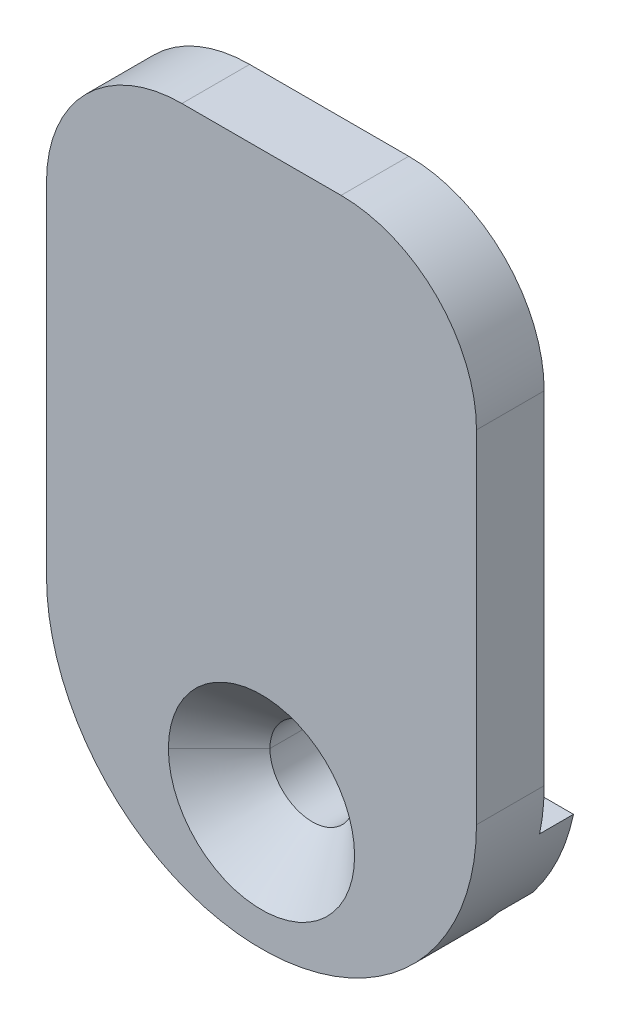
ISO-10303-21;
HEADER;
FILE_DESCRIPTION(('STEP AP214'),'2;1');
FILE_NAME('part.step','',(''),(''),'','','');
FILE_SCHEMA(('AUTOMOTIVE_DESIGN { 1 0 10303 214 1 1 1 1 }'));
ENDSEC;
DATA;
#1=APPLICATION_CONTEXT('core data for automotive mechanical design processes');
#2=APPLICATION_PROTOCOL_DEFINITION('international standard','automotive_design',2000,#1);
#3=PRODUCT_CONTEXT('',#1,'mechanical');
#4=PRODUCT('Part','Part','',(#3));
#5=PRODUCT_RELATED_PRODUCT_CATEGORY('part','',(#4));
#6=PRODUCT_DEFINITION_FORMATION('','',#4);
#7=PRODUCT_DEFINITION_CONTEXT('part definition',#1,'design');
#8=PRODUCT_DEFINITION('design','',#6,#7);
#9=PRODUCT_DEFINITION_SHAPE('','',#8);
#10=(LENGTH_UNIT() NAMED_UNIT(*) SI_UNIT(.MILLI.,.METRE.));
#11=(NAMED_UNIT(*) PLANE_ANGLE_UNIT() SI_UNIT($,.RADIAN.));
#12=(NAMED_UNIT(*) SI_UNIT($,.STERADIAN.) SOLID_ANGLE_UNIT());
#13=UNCERTAINTY_MEASURE_WITH_UNIT(LENGTH_MEASURE(1.E-05),#10,'distance_accuracy_value','');
#14=(GEOMETRIC_REPRESENTATION_CONTEXT(3) GLOBAL_UNCERTAINTY_ASSIGNED_CONTEXT((#13)) GLOBAL_UNIT_ASSIGNED_CONTEXT((#10,
#11,#12)) REPRESENTATION_CONTEXT('',''));
#15=CARTESIAN_POINT('',(0.,0.,0.));
#16=DIRECTION('',(0.,0.,1.));
#17=DIRECTION('',(1.,0.,0.));
#18=AXIS2_PLACEMENT_3D('',#15,#16,#17);
#19=CARTESIAN_POINT('',(0.,5.2,-4.));
#20=DIRECTION('',(0.,0.,-1.));
#21=DIRECTION('',(-1.,0.,0.));
#22=AXIS2_PLACEMENT_3D('',#19,#20,#21);
#23=PLANE('',#22);
#24=CARTESIAN_POINT('',(0.,5.2,-4.));
#25=DIRECTION('',(0.,0.,1.));
#26=DIRECTION('',(1.,0.,0.));
#27=AXIS2_PLACEMENT_3D('',#24,#25,#26);
#28=CIRCLE('',#27,12.7);
#29=CARTESIAN_POINT('',(-10.0224747442934,-2.59999999999999,-4.));
#30=VERTEX_POINT('',#29);
#31=CARTESIAN_POINT('',(10.0224747442934,-2.6,-4.));
#32=VERTEX_POINT('',#31);
#33=EDGE_CURVE('E151',#30,#32,#28,.T.);
#34=ORIENTED_EDGE('',*,*,#33,.F.);
#35=DIRECTION('',(-1.,0.,0.));
#36=VECTOR('',#35,1.);
#37=CARTESIAN_POINT('',(-12.7,-2.6,-4.));
#38=LINE('',#37,#36);
#39=EDGE_CURVE('E144',#30,#32,#38,.F.);
#40=ORIENTED_EDGE('',*,*,#39,.T.);
#41=EDGE_LOOP('',(#34,#40));
#42=FACE_BOUND('',#41,.T.);
#43=ADVANCED_FACE('F17',(#42),#23,.T.);
#44=CARTESIAN_POINT('',(-12.7,-2.6,-6.));
#45=DIRECTION('',(0.,1.,0.));
#46=DIRECTION('',(-1.,0.,0.));
#47=AXIS2_PLACEMENT_3D('',#44,#45,#46);
#48=PLANE('',#47);
#49=DIRECTION('',(-1.,0.,0.));
#50=VECTOR('',#49,1.);
#51=CARTESIAN_POINT('',(0.,-2.6,-6.));
#52=LINE('',#51,#50);
#53=CARTESIAN_POINT('',(10.0224747442934,-2.6,-6.));
#54=VERTEX_POINT('',#53);
#55=CARTESIAN_POINT('',(-10.0224747442934,-2.6,-6.));
#56=VERTEX_POINT('',#55);
#57=EDGE_CURVE('E142',#54,#56,#52,.T.);
#58=ORIENTED_EDGE('',*,*,#57,.F.);
#59=DIRECTION('',(0.,0.,1.));
#60=VECTOR('',#59,1.);
#61=CARTESIAN_POINT('',(10.0224747442934,-2.6,-4.));
#62=LINE('',#61,#60);
#63=EDGE_CURVE('E160',#32,#54,#62,.F.);
#64=ORIENTED_EDGE('',*,*,#63,.F.);
#65=ORIENTED_EDGE('',*,*,#39,.F.);
#66=DIRECTION('',(0.,0.,1.));
#67=VECTOR('',#66,1.);
#68=CARTESIAN_POINT('',(-10.0224747442934,-2.59999999999999,-4.));
#69=LINE('',#68,#67);
#70=EDGE_CURVE('E148',#56,#30,#69,.T.);
#71=ORIENTED_EDGE('',*,*,#70,.F.);
#72=EDGE_LOOP('',(#58,#64,#65,#71));
#73=FACE_BOUND('',#72,.T.);
#74=ADVANCED_FACE('F261',(#73),#48,.F.);
#75=CARTESIAN_POINT('',(-12.7,2.6,-6.));
#76=DIRECTION('',(0.,-1.,0.));
#77=DIRECTION('',(0.,0.,-1.));
#78=AXIS2_PLACEMENT_3D('',#75,#76,#77);
#79=PLANE('',#78);
#80=DIRECTION('',(-1.,0.,0.));
#81=VECTOR('',#80,1.);
#82=CARTESIAN_POINT('',(0.,2.6,-6.));
#83=LINE('',#82,#81);
#84=CARTESIAN_POINT('',(-12.4310096130604,2.60000000000001,-6.));
#85=VERTEX_POINT('',#84);
#86=CARTESIAN_POINT('',(12.4310096130604,2.6,-6.));
#87=VERTEX_POINT('',#86);
#88=EDGE_CURVE('E137',#85,#87,#83,.F.);
#89=ORIENTED_EDGE('',*,*,#88,.F.);
#90=DIRECTION('',(0.,0.,1.));
#91=VECTOR('',#90,1.);
#92=CARTESIAN_POINT('',(-12.4310096130604,2.60000000000001,-4.));
#93=LINE('',#92,#91);
#94=CARTESIAN_POINT('',(-12.4310096130604,2.60000000000001,-4.));
#95=VERTEX_POINT('',#94);
#96=EDGE_CURVE('E145',#95,#85,#93,.F.);
#97=ORIENTED_EDGE('',*,*,#96,.F.);
#98=DIRECTION('',(-1.,0.,0.));
#99=VECTOR('',#98,1.);
#100=CARTESIAN_POINT('',(0.,2.6,-4.));
#101=LINE('',#100,#99);
#102=CARTESIAN_POINT('',(12.4310096130604,2.6,-4.));
#103=VERTEX_POINT('',#102);
#104=EDGE_CURVE('E115',#103,#95,#101,.T.);
#105=ORIENTED_EDGE('',*,*,#104,.F.);
#106=DIRECTION('',(0.,0.,1.));
#107=VECTOR('',#106,1.);
#108=CARTESIAN_POINT('',(12.4310096130604,2.6,-4.));
#109=LINE('',#108,#107);
#110=EDGE_CURVE('E156',#87,#103,#109,.T.);
#111=ORIENTED_EDGE('',*,*,#110,.F.);
#112=EDGE_LOOP('',(#89,#97,#105,#111));
#113=FACE_BOUND('',#112,.T.);
#114=ADVANCED_FACE('F253',(#113),#79,.F.);
#115=CARTESIAN_POINT('',(0.,5.2,-6.));
#116=DIRECTION('',(0.,0.,-1.));
#117=DIRECTION('',(-1.,0.,0.));
#118=AXIS2_PLACEMENT_3D('',#115,#116,#117);
#119=PLANE('',#118);
#120=CARTESIAN_POINT('',(0.,0.,-6.));
#121=DIRECTION('',(0.,0.,1.));
#122=DIRECTION('',(1.,0.,0.));
#123=AXIS2_PLACEMENT_3D('',#120,#121,#122);
#124=CIRCLE('',#123,2.5);
#125=CARTESIAN_POINT('',(2.5,0.,-6.));
#126=VERTEX_POINT('',#125);
#127=CARTESIAN_POINT('',(-2.5,0.,-6.));
#128=VERTEX_POINT('',#127);
#129=EDGE_CURVE('E113',#126,#128,#124,.T.);
#130=ORIENTED_EDGE('',*,*,#129,.T.);
#131=CARTESIAN_POINT('',(0.,0.,-6.));
#132=DIRECTION('',(0.,0.,1.));
#133=DIRECTION('',(1.,0.,0.));
#134=AXIS2_PLACEMENT_3D('',#131,#132,#133);
#135=CIRCLE('',#134,2.5);
#136=EDGE_CURVE('E20',#128,#126,#135,.T.);
#137=ORIENTED_EDGE('',*,*,#136,.T.);
#138=EDGE_LOOP('',(#130,#137));
#139=FACE_BOUND('',#138,.T.);
#140=ORIENTED_EDGE('',*,*,#88,.T.);
#141=CARTESIAN_POINT('',(0.,5.2,-6.));
#142=DIRECTION('',(0.,0.,1.));
#143=DIRECTION('',(1.,0.,0.));
#144=AXIS2_PLACEMENT_3D('',#141,#142,#143);
#145=CIRCLE('',#144,12.7);
#146=EDGE_CURVE('E159',#54,#87,#145,.T.);
#147=ORIENTED_EDGE('',*,*,#146,.F.);
#148=ORIENTED_EDGE('',*,*,#57,.T.);
#149=CARTESIAN_POINT('',(0.,5.2,-6.));
#150=DIRECTION('',(0.,0.,1.));
#151=DIRECTION('',(1.,0.,0.));
#152=AXIS2_PLACEMENT_3D('',#149,#150,#151);
#153=CIRCLE('',#152,12.7);
#154=EDGE_CURVE('E135',#85,#56,#153,.T.);
#155=ORIENTED_EDGE('',*,*,#154,.F.);
#156=EDGE_LOOP('',(#140,#147,#148,#155));
#157=FACE_BOUND('',#156,.T.);
#158=ADVANCED_FACE('F111',(#139,#157),#119,.T.);
#159=CARTESIAN_POINT('',(0.,5.2,-4.));
#160=DIRECTION('',(0.,0.,-1.));
#161=DIRECTION('',(-1.,0.,0.));
#162=AXIS2_PLACEMENT_3D('',#159,#160,#161);
#163=PLANE('',#162);
#164=CARTESIAN_POINT('',(4.7,25.4,-4.));
#165=DIRECTION('',(0.,0.,1.));
#166=DIRECTION('',(1.,0.,0.));
#167=AXIS2_PLACEMENT_3D('',#164,#165,#166);
#168=CIRCLE('',#167,8.);
#169=CARTESIAN_POINT('',(12.7,25.4,-4.));
#170=VERTEX_POINT('',#169);
#171=CARTESIAN_POINT('',(4.7,33.4,-4.));
#172=VERTEX_POINT('',#171);
#173=EDGE_CURVE('E140',#170,#172,#168,.T.);
#174=ORIENTED_EDGE('',*,*,#173,.F.);
#175=DIRECTION('',(0.,1.,0.));
#176=VECTOR('',#175,1.);
#177=CARTESIAN_POINT('',(12.7,33.4,-4.));
#178=LINE('',#177,#176);
#179=CARTESIAN_POINT('',(12.7,5.2,-4.));
#180=VERTEX_POINT('',#179);
#181=EDGE_CURVE('E153',#180,#170,#178,.T.);
#182=ORIENTED_EDGE('',*,*,#181,.F.);
#183=CARTESIAN_POINT('',(0.,5.2,-4.));
#184=DIRECTION('',(0.,0.,1.));
#185=DIRECTION('',(1.,0.,0.));
#186=AXIS2_PLACEMENT_3D('',#183,#184,#185);
#187=CIRCLE('',#186,12.7);
#188=EDGE_CURVE('E158',#103,#180,#187,.T.);
#189=ORIENTED_EDGE('',*,*,#188,.F.);
#190=ORIENTED_EDGE('',*,*,#104,.T.);
#191=CARTESIAN_POINT('',(0.,5.2,-4.));
#192=DIRECTION('',(0.,0.,1.));
#193=DIRECTION('',(1.,0.,0.));
#194=AXIS2_PLACEMENT_3D('',#191,#192,#193);
#195=CIRCLE('',#194,12.7);
#196=CARTESIAN_POINT('',(-12.7,5.2,-4.));
#197=VERTEX_POINT('',#196);
#198=EDGE_CURVE('E147',#197,#95,#195,.T.);
#199=ORIENTED_EDGE('',*,*,#198,.F.);
#200=DIRECTION('',(0.,-1.,0.));
#201=VECTOR('',#200,1.);
#202=CARTESIAN_POINT('',(-12.7,33.4,-4.));
#203=LINE('',#202,#201);
#204=CARTESIAN_POINT('',(-12.7,25.4,-4.));
#205=VERTEX_POINT('',#204);
#206=EDGE_CURVE('E132',#205,#197,#203,.T.);
#207=ORIENTED_EDGE('',*,*,#206,.F.);
#208=CARTESIAN_POINT('',(-4.7,25.4,-4.));
#209=DIRECTION('',(0.,0.,1.));
#210=DIRECTION('',(1.,0.,0.));
#211=AXIS2_PLACEMENT_3D('',#208,#209,#210);
#212=CIRCLE('',#211,8.);
#213=CARTESIAN_POINT('',(-4.7,33.4,-4.));
#214=VERTEX_POINT('',#213);
#215=EDGE_CURVE('E178',#214,#205,#212,.T.);
#216=ORIENTED_EDGE('',*,*,#215,.F.);
#217=DIRECTION('',(1.,0.,0.));
#218=VECTOR('',#217,1.);
#219=CARTESIAN_POINT('',(-12.7,33.4,-4.));
#220=LINE('',#219,#218);
#221=EDGE_CURVE('E138',#172,#214,#220,.F.);
#222=ORIENTED_EDGE('',*,*,#221,.F.);
#223=EDGE_LOOP('',(#174,#182,#189,#190,#199,#207,#216,#222));
#224=FACE_BOUND('',#223,.T.);
#225=ADVANCED_FACE('F301',(#224),#163,.T.);
#226=CARTESIAN_POINT('',(0.,0.,-4.));
#227=DIRECTION('',(0.,0.,1.));
#228=DIRECTION('',(1.,0.,0.));
#229=AXIS2_PLACEMENT_3D('',#226,#227,#228);
#230=CYLINDRICAL_SURFACE('',#229,2.5);
#231=DIRECTION('',(0.,0.,1.));
#232=VECTOR('',#231,1.);
#233=CARTESIAN_POINT('',(-2.5,0.,-4.));
#234=LINE('',#233,#232);
#235=CARTESIAN_POINT('',(-2.49999999999829,0.,-2.99999999997169));
#236=VERTEX_POINT('',#235);
#237=EDGE_CURVE('E121',#128,#236,#234,.T.);
#238=ORIENTED_EDGE('',*,*,#237,.T.);
#239=CARTESIAN_POINT('',(0.,0.,-2.9999999999859));
#240=DIRECTION('',(0.,0.,1.));
#241=DIRECTION('',(1.,0.,0.));
#242=AXIS2_PLACEMENT_3D('',#239,#240,#241);
#243=CIRCLE('',#242,2.49999999999773);
#244=CARTESIAN_POINT('',(2.49999999999829,0.,-2.9999999999859));
#245=VERTEX_POINT('',#244);
#246=EDGE_CURVE('E124',#236,#245,#243,.T.);
#247=ORIENTED_EDGE('',*,*,#246,.T.);
#248=DIRECTION('',(0.,0.,1.));
#249=VECTOR('',#248,1.);
#250=CARTESIAN_POINT('',(2.5,0.,-4.));
#251=LINE('',#250,#249);
#252=EDGE_CURVE('E114',#245,#126,#251,.F.);
#253=ORIENTED_EDGE('',*,*,#252,.T.);
#254=ORIENTED_EDGE('',*,*,#136,.F.);
#255=EDGE_LOOP('',(#238,#247,#253,#254));
#256=FACE_BOUND('',#255,.T.);
#257=ADVANCED_FACE('F122',(#256),#230,.F.);
#258=CARTESIAN_POINT('',(0.,0.,-4.));
#259=DIRECTION('',(0.,0.,1.));
#260=DIRECTION('',(1.,0.,0.));
#261=AXIS2_PLACEMENT_3D('',#258,#259,#260);
#262=CYLINDRICAL_SURFACE('',#261,2.5);
#263=ORIENTED_EDGE('',*,*,#129,.F.);
#264=ORIENTED_EDGE('',*,*,#252,.F.);
#265=CARTESIAN_POINT('',(0.,0.,-2.9999999999859));
#266=DIRECTION('',(0.,0.,1.));
#267=DIRECTION('',(1.,0.,0.));
#268=AXIS2_PLACEMENT_3D('',#265,#266,#267);
#269=CIRCLE('',#268,2.49999999999773);
#270=EDGE_CURVE('E204',#245,#236,#269,.T.);
#271=ORIENTED_EDGE('',*,*,#270,.T.);
#272=ORIENTED_EDGE('',*,*,#237,.F.);
#273=EDGE_LOOP('',(#263,#264,#271,#272));
#274=FACE_BOUND('',#273,.T.);
#275=ADVANCED_FACE('F118',(#274),#262,.F.);
#276=CARTESIAN_POINT('',(-12.7,33.4,-4.));
#277=DIRECTION('',(0.,1.,0.));
#278=DIRECTION('',(0.,0.,1.));
#279=AXIS2_PLACEMENT_3D('',#276,#277,#278);
#280=PLANE('',#279);
#281=ORIENTED_EDGE('',*,*,#221,.T.);
#282=DIRECTION('',(0.,0.,1.));
#283=VECTOR('',#282,1.);
#284=CARTESIAN_POINT('',(-4.7,33.4,-4.));
#285=LINE('',#284,#283);
#286=CARTESIAN_POINT('',(-4.7,33.4,0.));
#287=VERTEX_POINT('',#286);
#288=EDGE_CURVE('E181',#287,#214,#285,.F.);
#289=ORIENTED_EDGE('',*,*,#288,.F.);
#290=DIRECTION('',(-1.,0.,0.));
#291=VECTOR('',#290,1.);
#292=CARTESIAN_POINT('',(0.,33.4,0.));
#293=LINE('',#292,#291);
#294=CARTESIAN_POINT('',(4.7,33.4,0.));
#295=VERTEX_POINT('',#294);
#296=EDGE_CURVE('E177',#287,#295,#293,.F.);
#297=ORIENTED_EDGE('',*,*,#296,.T.);
#298=DIRECTION('',(0.,0.,1.));
#299=VECTOR('',#298,1.);
#300=CARTESIAN_POINT('',(4.7,33.4,-4.));
#301=LINE('',#300,#299);
#302=EDGE_CURVE('E155',#172,#295,#301,.T.);
#303=ORIENTED_EDGE('',*,*,#302,.F.);
#304=EDGE_LOOP('',(#281,#289,#297,#303));
#305=FACE_BOUND('',#304,.T.);
#306=ADVANCED_FACE('F293',(#305),#280,.T.);
#307=CARTESIAN_POINT('',(4.7,25.4,-4.));
#308=DIRECTION('',(0.,0.,1.));
#309=DIRECTION('',(1.,0.,0.));
#310=AXIS2_PLACEMENT_3D('',#307,#308,#309);
#311=CYLINDRICAL_SURFACE('',#310,8.);
#312=ORIENTED_EDGE('',*,*,#173,.T.);
#313=ORIENTED_EDGE('',*,*,#302,.T.);
#314=CARTESIAN_POINT('',(4.7,25.4,0.));
#315=DIRECTION('',(0.,0.,1.));
#316=DIRECTION('',(1.,0.,0.));
#317=AXIS2_PLACEMENT_3D('',#314,#315,#316);
#318=CIRCLE('',#317,8.);
#319=CARTESIAN_POINT('',(12.7,25.4,0.));
#320=VERTEX_POINT('',#319);
#321=EDGE_CURVE('E174',#295,#320,#318,.F.);
#322=ORIENTED_EDGE('',*,*,#321,.T.);
#323=DIRECTION('',(0.,0.,1.));
#324=VECTOR('',#323,1.);
#325=CARTESIAN_POINT('',(12.7,25.4,-4.));
#326=LINE('',#325,#324);
#327=EDGE_CURVE('E152',#170,#320,#326,.T.);
#328=ORIENTED_EDGE('',*,*,#327,.F.);
#329=EDGE_LOOP('',(#312,#313,#322,#328));
#330=FACE_BOUND('',#329,.T.);
#331=ADVANCED_FACE('F290',(#330),#311,.T.);
#332=CARTESIAN_POINT('',(12.7,33.4,-4.));
#333=DIRECTION('',(1.,0.,0.));
#334=DIRECTION('',(0.,1.,0.));
#335=AXIS2_PLACEMENT_3D('',#332,#333,#334);
#336=PLANE('',#335);
#337=ORIENTED_EDGE('',*,*,#181,.T.);
#338=ORIENTED_EDGE('',*,*,#327,.T.);
#339=DIRECTION('',(0.,1.,0.));
#340=VECTOR('',#339,1.);
#341=CARTESIAN_POINT('',(12.7,5.2,0.));
#342=LINE('',#341,#340);
#343=CARTESIAN_POINT('',(12.7,5.2,0.));
#344=VERTEX_POINT('',#343);
#345=EDGE_CURVE('E173',#320,#344,#342,.F.);
#346=ORIENTED_EDGE('',*,*,#345,.T.);
#347=DIRECTION('',(0.,0.,1.));
#348=VECTOR('',#347,1.);
#349=CARTESIAN_POINT('',(12.7,5.2,-4.));
#350=LINE('',#349,#348);
#351=EDGE_CURVE('E186',#180,#344,#350,.T.);
#352=ORIENTED_EDGE('',*,*,#351,.F.);
#353=EDGE_LOOP('',(#337,#338,#346,#352));
#354=FACE_BOUND('',#353,.T.);
#355=ADVANCED_FACE('F241',(#354),#336,.T.);
#356=CARTESIAN_POINT('',(0.,5.2,-4.));
#357=DIRECTION('',(0.,0.,1.));
#358=DIRECTION('',(1.,0.,0.));
#359=AXIS2_PLACEMENT_3D('',#356,#357,#358);
#360=CYLINDRICAL_SURFACE('',#359,12.7);
#361=ORIENTED_EDGE('',*,*,#96,.T.);
#362=ORIENTED_EDGE('',*,*,#154,.T.);
#363=ORIENTED_EDGE('',*,*,#70,.T.);
#364=ORIENTED_EDGE('',*,*,#33,.T.);
#365=ORIENTED_EDGE('',*,*,#63,.T.);
#366=ORIENTED_EDGE('',*,*,#146,.T.);
#367=ORIENTED_EDGE('',*,*,#110,.T.);
#368=ORIENTED_EDGE('',*,*,#188,.T.);
#369=ORIENTED_EDGE('',*,*,#351,.T.);
#370=CARTESIAN_POINT('',(0.,5.2,0.));
#371=DIRECTION('',(0.,0.,1.));
#372=DIRECTION('',(1.,0.,0.));
#373=AXIS2_PLACEMENT_3D('',#370,#371,#372);
#374=CIRCLE('',#373,12.7);
#375=CARTESIAN_POINT('',(-12.7,5.2,0.));
#376=VERTEX_POINT('',#375);
#377=EDGE_CURVE('E170',#344,#376,#374,.F.);
#378=ORIENTED_EDGE('',*,*,#377,.T.);
#379=DIRECTION('',(0.,0.,1.));
#380=VECTOR('',#379,1.);
#381=CARTESIAN_POINT('',(-12.7,5.2,-4.));
#382=LINE('',#381,#380);
#383=EDGE_CURVE('E134',#197,#376,#382,.T.);
#384=ORIENTED_EDGE('',*,*,#383,.F.);
#385=ORIENTED_EDGE('',*,*,#198,.T.);
#386=EDGE_LOOP('',(#361,#362,#363,#364,#365,#366,#367,#368,#369,#378,#384,#385));
#387=FACE_BOUND('',#386,.T.);
#388=ADVANCED_FACE('F229',(#387),#360,.T.);
#389=CARTESIAN_POINT('',(-12.7,33.4,-4.));
#390=DIRECTION('',(-1.,0.,0.));
#391=DIRECTION('',(0.,-1.,0.));
#392=AXIS2_PLACEMENT_3D('',#389,#390,#391);
#393=PLANE('',#392);
#394=DIRECTION('',(0.,1.,0.));
#395=VECTOR('',#394,1.);
#396=CARTESIAN_POINT('',(-12.7,5.2,0.));
#397=LINE('',#396,#395);
#398=CARTESIAN_POINT('',(-12.7,25.4,0.));
#399=VERTEX_POINT('',#398);
#400=EDGE_CURVE('E169',#376,#399,#397,.T.);
#401=ORIENTED_EDGE('',*,*,#400,.T.);
#402=DIRECTION('',(0.,0.,1.));
#403=VECTOR('',#402,1.);
#404=CARTESIAN_POINT('',(-12.7,25.4,-4.));
#405=LINE('',#404,#403);
#406=EDGE_CURVE('E180',#205,#399,#405,.T.);
#407=ORIENTED_EDGE('',*,*,#406,.F.);
#408=ORIENTED_EDGE('',*,*,#206,.T.);
#409=ORIENTED_EDGE('',*,*,#383,.T.);
#410=EDGE_LOOP('',(#401,#407,#408,#409));
#411=FACE_BOUND('',#410,.T.);
#412=ADVANCED_FACE('F245',(#411),#393,.T.);
#413=CARTESIAN_POINT('',(-4.7,25.4,-4.));
#414=DIRECTION('',(0.,0.,1.));
#415=DIRECTION('',(1.,0.,0.));
#416=AXIS2_PLACEMENT_3D('',#413,#414,#415);
#417=CYLINDRICAL_SURFACE('',#416,8.);
#418=ORIENTED_EDGE('',*,*,#215,.T.);
#419=ORIENTED_EDGE('',*,*,#406,.T.);
#420=CARTESIAN_POINT('',(-4.7,25.4,0.));
#421=DIRECTION('',(0.,0.,1.));
#422=DIRECTION('',(1.,0.,0.));
#423=AXIS2_PLACEMENT_3D('',#420,#421,#422);
#424=CIRCLE('',#423,8.);
#425=EDGE_CURVE('E166',#399,#287,#424,.F.);
#426=ORIENTED_EDGE('',*,*,#425,.T.);
#427=ORIENTED_EDGE('',*,*,#288,.T.);
#428=EDGE_LOOP('',(#418,#419,#426,#427));
#429=FACE_BOUND('',#428,.T.);
#430=ADVANCED_FACE('F280',(#429),#417,.T.);
#431=CARTESIAN_POINT('',(0.,0.,-5.6843418860808E-11));
#432=DIRECTION('',(0.,0.,1.));
#433=DIRECTION('',(1.,0.,0.));
#434=AXIS2_PLACEMENT_3D('',#431,#432,#433);
#435=CONICAL_SURFACE('',#434,5.49999999992679,0.785398163397448);
#436=DIRECTION('',(0.707106781186547,0.,-0.707106781186548));
#437=VECTOR('',#436,1.);
#438=CARTESIAN_POINT('',(-499000.,6.11098752774529E-11,498994.5));
#439=LINE('',#438,#437);
#440=CARTESIAN_POINT('',(-5.49999999992679,0.,-5.6843418860808E-11));
#441=VERTEX_POINT('',#440);
#442=EDGE_CURVE('E206',#236,#441,#439,.F.);
#443=ORIENTED_EDGE('',*,*,#442,.T.);
#444=CARTESIAN_POINT('',(0.,0.,-5.6843418860808E-11));
#445=DIRECTION('',(0.,0.,1.));
#446=DIRECTION('',(1.,0.,0.));
#447=AXIS2_PLACEMENT_3D('',#444,#445,#446);
#448=CIRCLE('',#447,5.49999999992679);
#449=CARTESIAN_POINT('',(5.49999999992679,0.,-5.6843418860808E-11));
#450=VERTEX_POINT('',#449);
#451=EDGE_CURVE('E26',#441,#450,#448,.T.);
#452=ORIENTED_EDGE('',*,*,#451,.T.);
#453=DIRECTION('',(-0.707106781186547,0.,-0.707106781186548));
#454=VECTOR('',#453,1.);
#455=CARTESIAN_POINT('',(499000.,0.,498994.5));
#456=LINE('',#455,#454);
#457=EDGE_CURVE('E34',#450,#245,#456,.T.);
#458=ORIENTED_EDGE('',*,*,#457,.T.);
#459=ORIENTED_EDGE('',*,*,#246,.F.);
#460=EDGE_LOOP('',(#443,#452,#458,#459));
#461=FACE_BOUND('',#460,.T.);
#462=ADVANCED_FACE('F275',(#461),#435,.F.);
#463=CARTESIAN_POINT('',(0.,0.,-5.6843418860808E-11));
#464=DIRECTION('',(0.,0.,1.));
#465=DIRECTION('',(1.,0.,0.));
#466=AXIS2_PLACEMENT_3D('',#463,#464,#465);
#467=CONICAL_SURFACE('',#466,5.49999999992679,0.785398163397448);
#468=ORIENTED_EDGE('',*,*,#270,.F.);
#469=ORIENTED_EDGE('',*,*,#457,.F.);
#470=CARTESIAN_POINT('',(0.,0.,-5.6843418860808E-11));
#471=DIRECTION('',(0.,0.,1.));
#472=DIRECTION('',(1.,0.,0.));
#473=AXIS2_PLACEMENT_3D('',#470,#471,#472);
#474=CIRCLE('',#473,5.49999999992679);
#475=EDGE_CURVE('E11',#450,#441,#474,.T.);
#476=ORIENTED_EDGE('',*,*,#475,.T.);
#477=ORIENTED_EDGE('',*,*,#442,.F.);
#478=EDGE_LOOP('',(#468,#469,#476,#477));
#479=FACE_BOUND('',#478,.T.);
#480=ADVANCED_FACE('F211',(#479),#467,.F.);
#481=CARTESIAN_POINT('',(0.,5.2,0.));
#482=DIRECTION('',(0.,0.,-1.));
#483=DIRECTION('',(-1.,0.,0.));
#484=AXIS2_PLACEMENT_3D('',#481,#482,#483);
#485=PLANE('',#484);
#486=ORIENTED_EDGE('',*,*,#451,.F.);
#487=ORIENTED_EDGE('',*,*,#475,.F.);
#488=EDGE_LOOP('',(#486,#487));
#489=FACE_BOUND('',#488,.T.);
#490=ORIENTED_EDGE('',*,*,#400,.F.);
#491=ORIENTED_EDGE('',*,*,#377,.F.);
#492=ORIENTED_EDGE('',*,*,#345,.F.);
#493=ORIENTED_EDGE('',*,*,#321,.F.);
#494=ORIENTED_EDGE('',*,*,#296,.F.);
#495=ORIENTED_EDGE('',*,*,#425,.F.);
#496=EDGE_LOOP('',(#490,#491,#492,#493,#494,#495));
#497=FACE_BOUND('',#496,.T.);
#498=ADVANCED_FACE('F238',(#489,#497),#485,.F.);
#499=CLOSED_SHELL('',(#43,#74,#114,#158,#225,#257,#275,#306,#331,#355,#388,#412,#430,#462,#480,#498));
#500=MANIFOLD_SOLID_BREP('B1',#499);
#501=ADVANCED_BREP_SHAPE_REPRESENTATION('',(#18,#500),#14);
#502=SHAPE_DEFINITION_REPRESENTATION(#9,#501);
ENDSEC;
END-ISO-10303-21;
